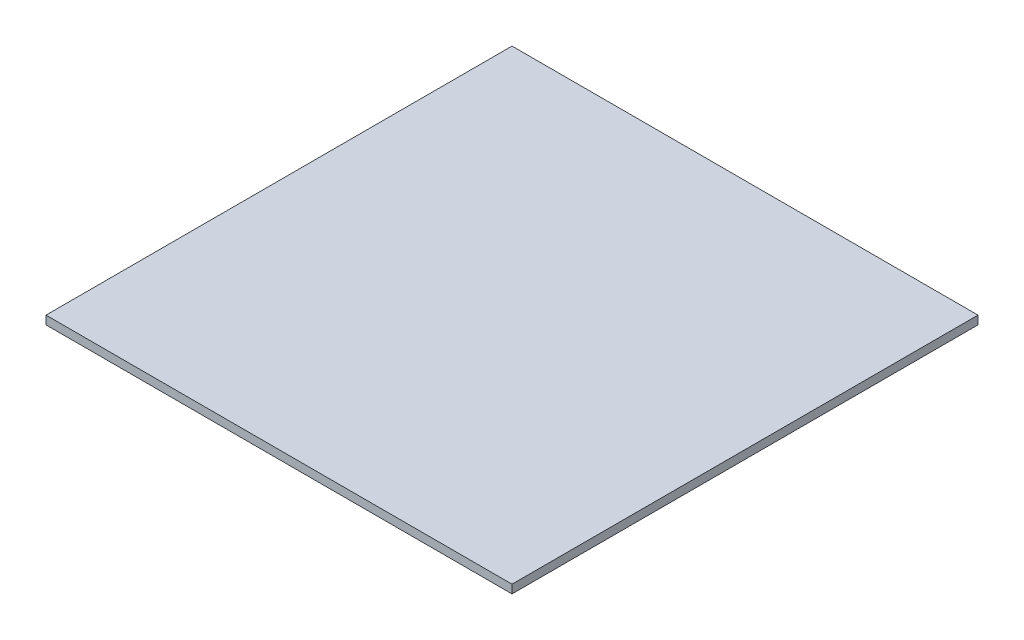
ISO-10303-21;
HEADER;
FILE_DESCRIPTION(('STEP AP214'),'2;1');
FILE_NAME('part.step','',(''),(''),'','','');
FILE_SCHEMA(('AUTOMOTIVE_DESIGN { 1 0 10303 214 1 1 1 1 }'));
ENDSEC;
DATA;
#1=APPLICATION_CONTEXT('core data for automotive mechanical design processes');
#2=APPLICATION_PROTOCOL_DEFINITION('international standard','automotive_design',2000,#1);
#3=PRODUCT_CONTEXT('',#1,'mechanical');
#4=PRODUCT('Part','Part','',(#3));
#5=PRODUCT_RELATED_PRODUCT_CATEGORY('part','',(#4));
#6=PRODUCT_DEFINITION_FORMATION('','',#4);
#7=PRODUCT_DEFINITION_CONTEXT('part definition',#1,'design');
#8=PRODUCT_DEFINITION('design','',#6,#7);
#9=PRODUCT_DEFINITION_SHAPE('','',#8);
#10=(LENGTH_UNIT() NAMED_UNIT(*) SI_UNIT(.MILLI.,.METRE.));
#11=(NAMED_UNIT(*) PLANE_ANGLE_UNIT() SI_UNIT($,.RADIAN.));
#12=(NAMED_UNIT(*) SI_UNIT($,.STERADIAN.) SOLID_ANGLE_UNIT());
#13=UNCERTAINTY_MEASURE_WITH_UNIT(LENGTH_MEASURE(1.E-05),#10,'distance_accuracy_value','');
#14=(GEOMETRIC_REPRESENTATION_CONTEXT(3) GLOBAL_UNCERTAINTY_ASSIGNED_CONTEXT((#13)) GLOBAL_UNIT_ASSIGNED_CONTEXT((#10,
#11,#12)) REPRESENTATION_CONTEXT('',''));
#15=CARTESIAN_POINT('',(0.,0.,0.));
#16=DIRECTION('',(0.,0.,1.));
#17=DIRECTION('',(1.,0.,0.));
#18=AXIS2_PLACEMENT_3D('',#15,#16,#17);
#19=CARTESIAN_POINT('',(0.,4.,0.));
#20=DIRECTION('',(1.,0.,0.));
#21=DIRECTION('',(0.,0.,-1.));
#22=AXIS2_PLACEMENT_3D('',#19,#20,#21);
#23=PLANE('',#22);
#24=DIRECTION('',(0.,0.,1.));
#25=VECTOR('',#24,1.);
#26=CARTESIAN_POINT('',(0.,0.,0.));
#27=LINE('',#26,#25);
#28=CARTESIAN_POINT('',(0.,0.,-220.));
#29=VERTEX_POINT('',#28);
#30=CARTESIAN_POINT('',(0.,0.,0.));
#31=VERTEX_POINT('',#30);
#32=EDGE_CURVE('E96',#29,#31,#27,.T.);
#33=ORIENTED_EDGE('',*,*,#32,.T.);
#34=DIRECTION('',(0.,-1.,0.));
#35=VECTOR('',#34,1.);
#36=CARTESIAN_POINT('',(0.,4.,0.));
#37=LINE('',#36,#35);
#38=CARTESIAN_POINT('',(0.,4.,0.));
#39=VERTEX_POINT('',#38);
#40=EDGE_CURVE('E11',#39,#31,#37,.T.);
#41=ORIENTED_EDGE('',*,*,#40,.F.);
#42=DIRECTION('',(0.,0.,1.));
#43=VECTOR('',#42,1.);
#44=CARTESIAN_POINT('',(0.,4.,0.));
#45=LINE('',#44,#43);
#46=CARTESIAN_POINT('',(0.,4.,-220.));
#47=VERTEX_POINT('',#46);
#48=EDGE_CURVE('E84',#47,#39,#45,.T.);
#49=ORIENTED_EDGE('',*,*,#48,.F.);
#50=DIRECTION('',(0.,-1.,0.));
#51=VECTOR('',#50,1.);
#52=CARTESIAN_POINT('',(0.,4.,-220.));
#53=LINE('',#52,#51);
#54=EDGE_CURVE('E92',#47,#29,#53,.T.);
#55=ORIENTED_EDGE('',*,*,#54,.T.);
#56=EDGE_LOOP('',(#33,#41,#49,#55));
#57=FACE_BOUND('',#56,.T.);
#58=ADVANCED_FACE('F33',(#57),#23,.F.);
#59=CARTESIAN_POINT('',(0.,4.,0.));
#60=DIRECTION('',(0.,0.,-1.));
#61=DIRECTION('',(-1.,0.,0.));
#62=AXIS2_PLACEMENT_3D('',#59,#60,#61);
#63=PLANE('',#62);
#64=DIRECTION('',(1.,0.,0.));
#65=VECTOR('',#64,1.);
#66=CARTESIAN_POINT('',(0.,0.,0.));
#67=LINE('',#66,#65);
#68=CARTESIAN_POINT('',(220.,0.,0.));
#69=VERTEX_POINT('',#68);
#70=EDGE_CURVE('E88',#31,#69,#67,.T.);
#71=ORIENTED_EDGE('',*,*,#70,.T.);
#72=DIRECTION('',(0.,-1.,0.));
#73=VECTOR('',#72,1.);
#74=CARTESIAN_POINT('',(220.,4.,0.));
#75=LINE('',#74,#73);
#76=CARTESIAN_POINT('',(220.,4.,0.));
#77=VERTEX_POINT('',#76);
#78=EDGE_CURVE('E41',#77,#69,#75,.T.);
#79=ORIENTED_EDGE('',*,*,#78,.F.);
#80=DIRECTION('',(1.,0.,0.));
#81=VECTOR('',#80,1.);
#82=CARTESIAN_POINT('',(0.,4.,0.));
#83=LINE('',#82,#81);
#84=EDGE_CURVE('E79',#39,#77,#83,.T.);
#85=ORIENTED_EDGE('',*,*,#84,.F.);
#86=ORIENTED_EDGE('',*,*,#40,.T.);
#87=EDGE_LOOP('',(#71,#79,#85,#86));
#88=FACE_BOUND('',#87,.T.);
#89=ADVANCED_FACE('F87',(#88),#63,.F.);
#90=CARTESIAN_POINT('',(220.,4.,0.));
#91=DIRECTION('',(-1.,0.,0.));
#92=DIRECTION('',(0.,0.,1.));
#93=AXIS2_PLACEMENT_3D('',#90,#91,#92);
#94=PLANE('',#93);
#95=DIRECTION('',(0.,0.,-1.));
#96=VECTOR('',#95,1.);
#97=CARTESIAN_POINT('',(220.,0.,0.));
#98=LINE('',#97,#96);
#99=CARTESIAN_POINT('',(220.,0.,-220.));
#100=VERTEX_POINT('',#99);
#101=EDGE_CURVE('E66',#69,#100,#98,.T.);
#102=ORIENTED_EDGE('',*,*,#101,.T.);
#103=DIRECTION('',(0.,-1.,0.));
#104=VECTOR('',#103,1.);
#105=CARTESIAN_POINT('',(220.,4.,-220.));
#106=LINE('',#105,#104);
#107=CARTESIAN_POINT('',(220.,4.,-220.));
#108=VERTEX_POINT('',#107);
#109=EDGE_CURVE('E89',#108,#100,#106,.T.);
#110=ORIENTED_EDGE('',*,*,#109,.F.);
#111=DIRECTION('',(0.,0.,-1.));
#112=VECTOR('',#111,1.);
#113=CARTESIAN_POINT('',(220.,4.,0.));
#114=LINE('',#113,#112);
#115=EDGE_CURVE('E82',#77,#108,#114,.T.);
#116=ORIENTED_EDGE('',*,*,#115,.F.);
#117=ORIENTED_EDGE('',*,*,#78,.T.);
#118=EDGE_LOOP('',(#102,#110,#116,#117));
#119=FACE_BOUND('',#118,.T.);
#120=ADVANCED_FACE('F90',(#119),#94,.F.);
#121=CARTESIAN_POINT('',(0.,4.,-220.));
#122=DIRECTION('',(0.,0.,1.));
#123=DIRECTION('',(1.,0.,0.));
#124=AXIS2_PLACEMENT_3D('',#121,#122,#123);
#125=PLANE('',#124);
#126=DIRECTION('',(-1.,0.,0.));
#127=VECTOR('',#126,1.);
#128=CARTESIAN_POINT('',(0.,0.,-220.));
#129=LINE('',#128,#127);
#130=EDGE_CURVE('E72',#100,#29,#129,.T.);
#131=ORIENTED_EDGE('',*,*,#130,.T.);
#132=ORIENTED_EDGE('',*,*,#54,.F.);
#133=DIRECTION('',(-1.,0.,0.));
#134=VECTOR('',#133,1.);
#135=CARTESIAN_POINT('',(0.,4.,-220.));
#136=LINE('',#135,#134);
#137=EDGE_CURVE('E49',#108,#47,#136,.T.);
#138=ORIENTED_EDGE('',*,*,#137,.F.);
#139=ORIENTED_EDGE('',*,*,#109,.T.);
#140=EDGE_LOOP('',(#131,#132,#138,#139));
#141=FACE_BOUND('',#140,.T.);
#142=ADVANCED_FACE('F103',(#141),#125,.F.);
#143=CARTESIAN_POINT('',(0.,4.,0.));
#144=DIRECTION('',(0.,-1.,0.));
#145=DIRECTION('',(0.,0.,-1.));
#146=AXIS2_PLACEMENT_3D('',#143,#144,#145);
#147=PLANE('',#146);
#148=ORIENTED_EDGE('',*,*,#48,.T.);
#149=ORIENTED_EDGE('',*,*,#84,.T.);
#150=ORIENTED_EDGE('',*,*,#115,.T.);
#151=ORIENTED_EDGE('',*,*,#137,.T.);
#152=EDGE_LOOP('',(#148,#149,#150,#151));
#153=FACE_BOUND('',#152,.T.);
#154=ADVANCED_FACE('F80',(#153),#147,.F.);
#155=CARTESIAN_POINT('',(0.,0.,0.));
#156=DIRECTION('',(0.,-1.,0.));
#157=DIRECTION('',(0.,0.,-1.));
#158=AXIS2_PLACEMENT_3D('',#155,#156,#157);
#159=PLANE('',#158);
#160=ORIENTED_EDGE('',*,*,#32,.F.);
#161=ORIENTED_EDGE('',*,*,#130,.F.);
#162=ORIENTED_EDGE('',*,*,#101,.F.);
#163=ORIENTED_EDGE('',*,*,#70,.F.);
#164=EDGE_LOOP('',(#160,#161,#162,#163));
#165=FACE_BOUND('',#164,.T.);
#166=ADVANCED_FACE('F106',(#165),#159,.T.);
#167=CLOSED_SHELL('',(#58,#89,#120,#142,#154,#166));
#168=MANIFOLD_SOLID_BREP('B2',#167);
#169=ADVANCED_BREP_SHAPE_REPRESENTATION('',(#18,#168),#14);
#170=SHAPE_DEFINITION_REPRESENTATION(#9,#169);
ENDSEC;
END-ISO-10303-21;
